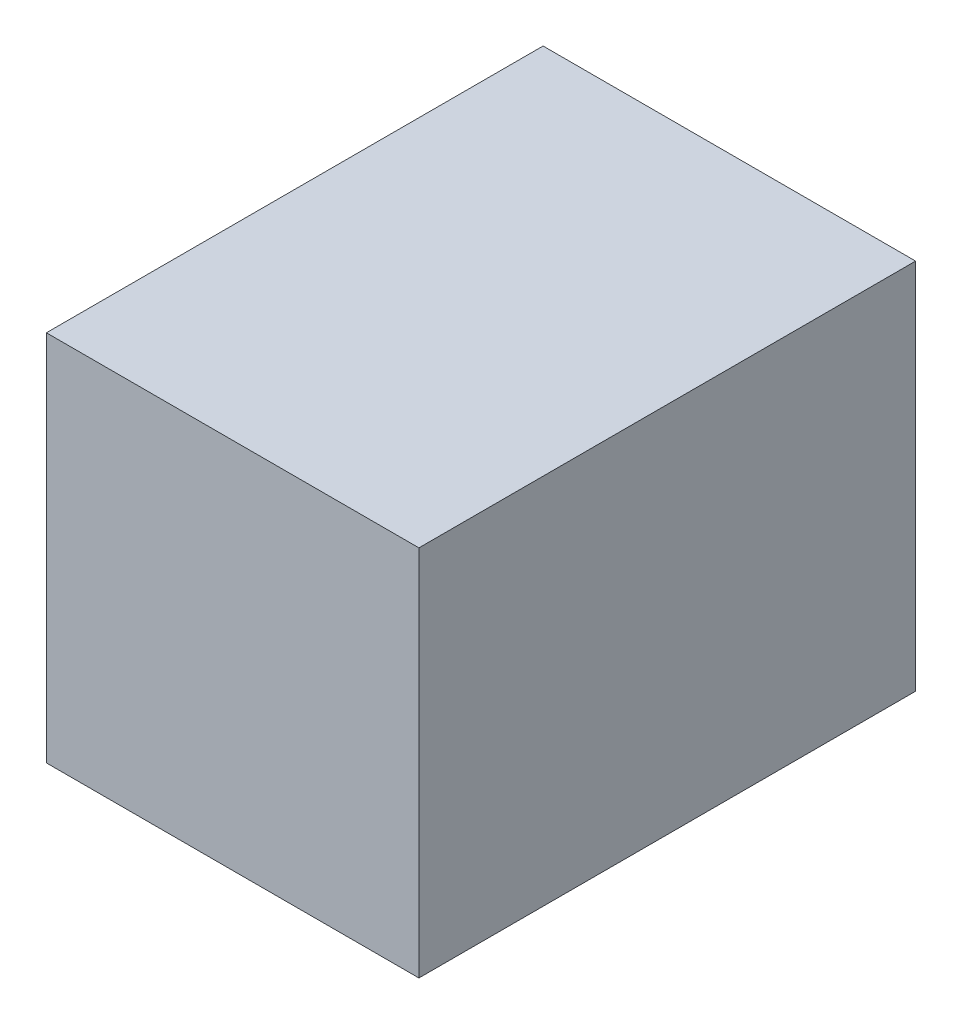
ISO-10303-21;
HEADER;
FILE_DESCRIPTION(('STEP AP214'),'2;1');
FILE_NAME('part.step','',(''),(''),'','','');
FILE_SCHEMA(('AUTOMOTIVE_DESIGN { 1 0 10303 214 1 1 1 1 }'));
ENDSEC;
DATA;
#1=APPLICATION_CONTEXT('core data for automotive mechanical design processes');
#2=APPLICATION_PROTOCOL_DEFINITION('international standard','automotive_design',2000,#1);
#3=PRODUCT_CONTEXT('',#1,'mechanical');
#4=PRODUCT('Part','Part','',(#3));
#5=PRODUCT_RELATED_PRODUCT_CATEGORY('part','',(#4));
#6=PRODUCT_DEFINITION_FORMATION('','',#4);
#7=PRODUCT_DEFINITION_CONTEXT('part definition',#1,'design');
#8=PRODUCT_DEFINITION('design','',#6,#7);
#9=PRODUCT_DEFINITION_SHAPE('','',#8);
#10=(LENGTH_UNIT() NAMED_UNIT(*) SI_UNIT(.MILLI.,.METRE.));
#11=(NAMED_UNIT(*) PLANE_ANGLE_UNIT() SI_UNIT($,.RADIAN.));
#12=(NAMED_UNIT(*) SI_UNIT($,.STERADIAN.) SOLID_ANGLE_UNIT());
#13=UNCERTAINTY_MEASURE_WITH_UNIT(LENGTH_MEASURE(1.E-05),#10,'distance_accuracy_value','');
#14=(GEOMETRIC_REPRESENTATION_CONTEXT(3) GLOBAL_UNCERTAINTY_ASSIGNED_CONTEXT((#13)) GLOBAL_UNIT_ASSIGNED_CONTEXT((#10,
#11,#12)) REPRESENTATION_CONTEXT('',''));
#15=CARTESIAN_POINT('',(0.,0.,0.));
#16=DIRECTION('',(0.,0.,1.));
#17=DIRECTION('',(1.,0.,0.));
#18=AXIS2_PLACEMENT_3D('',#15,#16,#17);
#19=CARTESIAN_POINT('',(15.,-15.,40.));
#20=DIRECTION('',(-1.,0.,0.));
#21=DIRECTION('',(0.,0.,1.));
#22=AXIS2_PLACEMENT_3D('',#19,#20,#21);
#23=PLANE('',#22);
#24=DIRECTION('',(0.,1.,0.));
#25=VECTOR('',#24,1.);
#26=CARTESIAN_POINT('',(15.,-15.,0.));
#27=LINE('',#26,#25);
#28=CARTESIAN_POINT('',(15.,-15.,0.));
#29=VERTEX_POINT('',#28);
#30=CARTESIAN_POINT('',(15.,15.,0.));
#31=VERTEX_POINT('',#30);
#32=EDGE_CURVE('E113',#29,#31,#27,.T.);
#33=ORIENTED_EDGE('',*,*,#32,.T.);
#34=DIRECTION('',(0.,0.,-1.));
#35=VECTOR('',#34,1.);
#36=CARTESIAN_POINT('',(15.,15.,40.));
#37=LINE('',#36,#35);
#38=CARTESIAN_POINT('',(15.,15.,40.));
#39=VERTEX_POINT('',#38);
#40=EDGE_CURVE('E11',#39,#31,#37,.T.);
#41=ORIENTED_EDGE('',*,*,#40,.F.);
#42=DIRECTION('',(0.,1.,0.));
#43=VECTOR('',#42,1.);
#44=CARTESIAN_POINT('',(15.,-15.,40.));
#45=LINE('',#44,#43);
#46=CARTESIAN_POINT('',(15.,-15.,40.));
#47=VERTEX_POINT('',#46);
#48=EDGE_CURVE('E97',#47,#39,#45,.T.);
#49=ORIENTED_EDGE('',*,*,#48,.F.);
#50=DIRECTION('',(0.,0.,-1.));
#51=VECTOR('',#50,1.);
#52=CARTESIAN_POINT('',(15.,-15.,40.));
#53=LINE('',#52,#51);
#54=EDGE_CURVE('E109',#47,#29,#53,.T.);
#55=ORIENTED_EDGE('',*,*,#54,.T.);
#56=EDGE_LOOP('',(#33,#41,#49,#55));
#57=FACE_BOUND('',#56,.T.);
#58=ADVANCED_FACE('F45',(#57),#23,.F.);
#59=CARTESIAN_POINT('',(-15.,15.,40.));
#60=DIRECTION('',(0.,-1.,0.));
#61=DIRECTION('',(0.,0.,-1.));
#62=AXIS2_PLACEMENT_3D('',#59,#60,#61);
#63=PLANE('',#62);
#64=DIRECTION('',(-1.,0.,0.));
#65=VECTOR('',#64,1.);
#66=CARTESIAN_POINT('',(-15.,15.,0.));
#67=LINE('',#66,#65);
#68=CARTESIAN_POINT('',(-15.,15.,0.));
#69=VERTEX_POINT('',#68);
#70=EDGE_CURVE('E102',#31,#69,#67,.T.);
#71=ORIENTED_EDGE('',*,*,#70,.T.);
#72=DIRECTION('',(0.,0.,-1.));
#73=VECTOR('',#72,1.);
#74=CARTESIAN_POINT('',(-15.,15.,40.));
#75=LINE('',#74,#73);
#76=CARTESIAN_POINT('',(-15.,15.,40.));
#77=VERTEX_POINT('',#76);
#78=EDGE_CURVE('E54',#77,#69,#75,.T.);
#79=ORIENTED_EDGE('',*,*,#78,.F.);
#80=DIRECTION('',(-1.,0.,0.));
#81=VECTOR('',#80,1.);
#82=CARTESIAN_POINT('',(-15.,15.,40.));
#83=LINE('',#82,#81);
#84=EDGE_CURVE('E92',#39,#77,#83,.T.);
#85=ORIENTED_EDGE('',*,*,#84,.F.);
#86=ORIENTED_EDGE('',*,*,#40,.T.);
#87=EDGE_LOOP('',(#71,#79,#85,#86));
#88=FACE_BOUND('',#87,.T.);
#89=ADVANCED_FACE('F101',(#88),#63,.F.);
#90=CARTESIAN_POINT('',(-15.,-15.,40.));
#91=DIRECTION('',(1.,0.,0.));
#92=DIRECTION('',(0.,0.,-1.));
#93=AXIS2_PLACEMENT_3D('',#90,#91,#92);
#94=PLANE('',#93);
#95=DIRECTION('',(0.,-1.,0.));
#96=VECTOR('',#95,1.);
#97=CARTESIAN_POINT('',(-15.,-15.,0.));
#98=LINE('',#97,#96);
#99=CARTESIAN_POINT('',(-15.,-15.,0.));
#100=VERTEX_POINT('',#99);
#101=EDGE_CURVE('E79',#69,#100,#98,.T.);
#102=ORIENTED_EDGE('',*,*,#101,.T.);
#103=DIRECTION('',(0.,0.,-1.));
#104=VECTOR('',#103,1.);
#105=CARTESIAN_POINT('',(-15.,-15.,40.));
#106=LINE('',#105,#104);
#107=CARTESIAN_POINT('',(-15.,-15.,40.));
#108=VERTEX_POINT('',#107);
#109=EDGE_CURVE('E104',#108,#100,#106,.T.);
#110=ORIENTED_EDGE('',*,*,#109,.F.);
#111=DIRECTION('',(0.,-1.,0.));
#112=VECTOR('',#111,1.);
#113=CARTESIAN_POINT('',(-15.,-15.,40.));
#114=LINE('',#113,#112);
#115=EDGE_CURVE('E95',#77,#108,#114,.T.);
#116=ORIENTED_EDGE('',*,*,#115,.F.);
#117=ORIENTED_EDGE('',*,*,#78,.T.);
#118=EDGE_LOOP('',(#102,#110,#116,#117));
#119=FACE_BOUND('',#118,.T.);
#120=ADVANCED_FACE('F105',(#119),#94,.F.);
#121=CARTESIAN_POINT('',(-15.,-15.,40.));
#122=DIRECTION('',(0.,1.,0.));
#123=DIRECTION('',(0.,0.,1.));
#124=AXIS2_PLACEMENT_3D('',#121,#122,#123);
#125=PLANE('',#124);
#126=DIRECTION('',(1.,0.,0.));
#127=VECTOR('',#126,1.);
#128=CARTESIAN_POINT('',(-15.,-15.,0.));
#129=LINE('',#128,#127);
#130=EDGE_CURVE('E85',#100,#29,#129,.T.);
#131=ORIENTED_EDGE('',*,*,#130,.T.);
#132=ORIENTED_EDGE('',*,*,#54,.F.);
#133=DIRECTION('',(1.,0.,0.));
#134=VECTOR('',#133,1.);
#135=CARTESIAN_POINT('',(-15.,-15.,40.));
#136=LINE('',#135,#134);
#137=EDGE_CURVE('E62',#108,#47,#136,.T.);
#138=ORIENTED_EDGE('',*,*,#137,.F.);
#139=ORIENTED_EDGE('',*,*,#109,.T.);
#140=EDGE_LOOP('',(#131,#132,#138,#139));
#141=FACE_BOUND('',#140,.T.);
#142=ADVANCED_FACE('F126',(#141),#125,.F.);
#143=CARTESIAN_POINT('',(0.,0.,40.));
#144=DIRECTION('',(0.,0.,-1.));
#145=DIRECTION('',(-1.,0.,0.));
#146=AXIS2_PLACEMENT_3D('',#143,#144,#145);
#147=PLANE('',#146);
#148=ORIENTED_EDGE('',*,*,#48,.T.);
#149=ORIENTED_EDGE('',*,*,#84,.T.);
#150=ORIENTED_EDGE('',*,*,#115,.T.);
#151=ORIENTED_EDGE('',*,*,#137,.T.);
#152=EDGE_LOOP('',(#148,#149,#150,#151));
#153=FACE_BOUND('',#152,.T.);
#154=ADVANCED_FACE('F93',(#153),#147,.F.);
#155=CARTESIAN_POINT('',(0.,0.,0.));
#156=DIRECTION('',(0.,0.,-1.));
#157=DIRECTION('',(-1.,0.,0.));
#158=AXIS2_PLACEMENT_3D('',#155,#156,#157);
#159=PLANE('',#158);
#160=ORIENTED_EDGE('',*,*,#32,.F.);
#161=ORIENTED_EDGE('',*,*,#130,.F.);
#162=ORIENTED_EDGE('',*,*,#101,.F.);
#163=ORIENTED_EDGE('',*,*,#70,.F.);
#164=EDGE_LOOP('',(#160,#161,#162,#163));
#165=FACE_BOUND('',#164,.T.);
#166=ADVANCED_FACE('F129',(#165),#159,.T.);
#167=CLOSED_SHELL('',(#58,#89,#120,#142,#154,#166));
#168=MANIFOLD_SOLID_BREP('B2',#167);
#169=ADVANCED_BREP_SHAPE_REPRESENTATION('',(#18,#168),#14);
#170=SHAPE_DEFINITION_REPRESENTATION(#9,#169);
ENDSEC;
END-ISO-10303-21;
